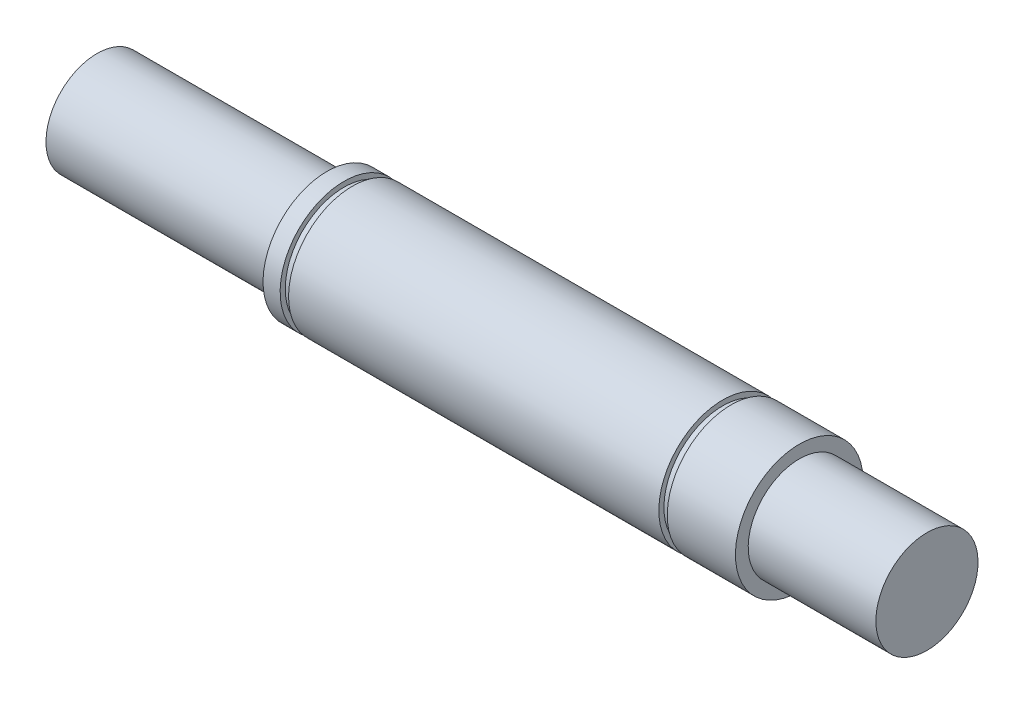
ISO-10303-21;
HEADER;
FILE_DESCRIPTION(('STEP AP214'),'2;1');
FILE_NAME('part.step','',(''),(''),'','','');
FILE_SCHEMA(('AUTOMOTIVE_DESIGN { 1 0 10303 214 1 1 1 1 }'));
ENDSEC;
DATA;
#1=APPLICATION_CONTEXT('core data for automotive mechanical design processes');
#2=APPLICATION_PROTOCOL_DEFINITION('international standard','automotive_design',2000,#1);
#3=PRODUCT_CONTEXT('',#1,'mechanical');
#4=PRODUCT('Part','Part','',(#3));
#5=PRODUCT_RELATED_PRODUCT_CATEGORY('part','',(#4));
#6=PRODUCT_DEFINITION_FORMATION('','',#4);
#7=PRODUCT_DEFINITION_CONTEXT('part definition',#1,'design');
#8=PRODUCT_DEFINITION('design','',#6,#7);
#9=PRODUCT_DEFINITION_SHAPE('','',#8);
#10=(LENGTH_UNIT() NAMED_UNIT(*) SI_UNIT(.MILLI.,.METRE.));
#11=(NAMED_UNIT(*) PLANE_ANGLE_UNIT() SI_UNIT($,.RADIAN.));
#12=(NAMED_UNIT(*) SI_UNIT($,.STERADIAN.) SOLID_ANGLE_UNIT());
#13=UNCERTAINTY_MEASURE_WITH_UNIT(LENGTH_MEASURE(1.E-05),#10,'distance_accuracy_value','');
#14=(GEOMETRIC_REPRESENTATION_CONTEXT(3) GLOBAL_UNCERTAINTY_ASSIGNED_CONTEXT((#13)) GLOBAL_UNIT_ASSIGNED_CONTEXT((#10,
#11,#12)) REPRESENTATION_CONTEXT('',''));
#15=CARTESIAN_POINT('',(0.,0.,0.));
#16=DIRECTION('',(0.,0.,1.));
#17=DIRECTION('',(1.,0.,0.));
#18=AXIS2_PLACEMENT_3D('',#15,#16,#17);
#19=CARTESIAN_POINT('',(-145.473243459258,-1.20454356635751,0.));
#20=DIRECTION('',(-1.,0.,0.));
#21=DIRECTION('',(0.,-1.,0.));
#22=AXIS2_PLACEMENT_3D('',#19,#20,#21);
#23=PLANE('',#22);
#24=CARTESIAN_POINT('',(-145.473243459258,-1.20454356635751,0.));
#25=DIRECTION('',(-1.,0.,0.));
#26=DIRECTION('',(0.,-1.,0.));
#27=AXIS2_PLACEMENT_3D('',#24,#25,#26);
#28=CIRCLE('',#27,4.);
#29=CARTESIAN_POINT('',(-145.473243459258,-5.20454356635751,0.));
#30=VERTEX_POINT('',#29);
#31=EDGE_CURVE('E10',#30,#30,#28,.T.);
#32=ORIENTED_EDGE('',*,*,#31,.F.);
#33=EDGE_LOOP('',(#32));
#34=FACE_BOUND('',#33,.T.);
#35=ADVANCED_FACE('F35',(#34),#23,.F.);
#36=CARTESIAN_POINT('',(-210.473243459258,-1.20454356635751,0.));
#37=DIRECTION('',(-1.,0.,0.));
#38=DIRECTION('',(0.,-1.,0.));
#39=AXIS2_PLACEMENT_3D('',#36,#37,#38);
#40=CYLINDRICAL_SURFACE('',#39,4.);
#41=CARTESIAN_POINT('',(-155.473243459258,-1.20454356635751,0.));
#42=DIRECTION('',(-1.,0.,0.));
#43=DIRECTION('',(0.,-1.,0.));
#44=AXIS2_PLACEMENT_3D('',#41,#42,#43);
#45=CIRCLE('',#44,4.);
#46=CARTESIAN_POINT('',(-155.473243459258,-5.20454356635751,0.));
#47=VERTEX_POINT('',#46);
#48=EDGE_CURVE('E41',#47,#47,#45,.T.);
#49=ORIENTED_EDGE('',*,*,#48,.F.);
#50=EDGE_LOOP('',(#49));
#51=FACE_BOUND('',#50,.T.);
#52=ORIENTED_EDGE('',*,*,#31,.T.);
#53=EDGE_LOOP('',(#52));
#54=FACE_BOUND('',#53,.T.);
#55=ADVANCED_FACE('F155',(#51,#54),#40,.T.);
#56=CARTESIAN_POINT('',(-155.473243459258,2.79545643364249,0.));
#57=DIRECTION('',(-1.,0.,0.));
#58=DIRECTION('',(0.,-1.,0.));
#59=AXIS2_PLACEMENT_3D('',#56,#57,#58);
#60=PLANE('',#59);
#61=CARTESIAN_POINT('',(-155.473243459258,-1.20454356635751,0.));
#62=DIRECTION('',(-1.,0.,0.));
#63=DIRECTION('',(0.,-1.,0.));
#64=AXIS2_PLACEMENT_3D('',#61,#62,#63);
#65=CIRCLE('',#64,5.);
#66=CARTESIAN_POINT('',(-155.473243459258,-6.20454356635751,0.));
#67=VERTEX_POINT('',#66);
#68=EDGE_CURVE('E45',#67,#67,#65,.T.);
#69=ORIENTED_EDGE('',*,*,#68,.F.);
#70=EDGE_LOOP('',(#69));
#71=FACE_BOUND('',#70,.T.);
#72=ORIENTED_EDGE('',*,*,#48,.T.);
#73=EDGE_LOOP('',(#72));
#74=FACE_BOUND('',#73,.T.);
#75=ADVANCED_FACE('F150',(#71,#74),#60,.F.);
#76=CARTESIAN_POINT('',(-210.473243459258,-1.20454356635751,0.));
#77=DIRECTION('',(-1.,0.,0.));
#78=DIRECTION('',(0.,-1.,0.));
#79=AXIS2_PLACEMENT_3D('',#76,#77,#78);
#80=CYLINDRICAL_SURFACE('',#79,5.);
#81=CARTESIAN_POINT('',(-160.813243459258,-1.20454356635751,0.));
#82=DIRECTION('',(-1.,0.,0.));
#83=DIRECTION('',(0.,-1.,0.));
#84=AXIS2_PLACEMENT_3D('',#81,#82,#83);
#85=CIRCLE('',#84,5.);
#86=CARTESIAN_POINT('',(-160.813243459258,-6.20454356635751,0.));
#87=VERTEX_POINT('',#86);
#88=EDGE_CURVE('E49',#87,#87,#85,.T.);
#89=ORIENTED_EDGE('',*,*,#88,.F.);
#90=EDGE_LOOP('',(#89));
#91=FACE_BOUND('',#90,.T.);
#92=ORIENTED_EDGE('',*,*,#68,.T.);
#93=EDGE_LOOP('',(#92));
#94=FACE_BOUND('',#93,.T.);
#95=ADVANCED_FACE('F144',(#91,#94),#80,.T.);
#96=CARTESIAN_POINT('',(-160.813243459258,3.79545643364249,0.));
#97=DIRECTION('',(1.,0.,0.));
#98=DIRECTION('',(0.,1.,0.));
#99=AXIS2_PLACEMENT_3D('',#96,#97,#98);
#100=PLANE('',#99);
#101=CARTESIAN_POINT('',(-160.813243459258,-1.20454356635751,0.));
#102=DIRECTION('',(-1.,0.,0.));
#103=DIRECTION('',(0.,-1.,0.));
#104=AXIS2_PLACEMENT_3D('',#101,#102,#103);
#105=CIRCLE('',#104,4.6);
#106=CARTESIAN_POINT('',(-160.813243459258,-5.80454356635751,0.));
#107=VERTEX_POINT('',#106);
#108=EDGE_CURVE('E54',#107,#107,#105,.T.);
#109=ORIENTED_EDGE('',*,*,#108,.F.);
#110=EDGE_LOOP('',(#109));
#111=FACE_BOUND('',#110,.T.);
#112=ORIENTED_EDGE('',*,*,#88,.T.);
#113=EDGE_LOOP('',(#112));
#114=FACE_BOUND('',#113,.T.);
#115=ADVANCED_FACE('F138',(#111,#114),#100,.F.);
#116=CARTESIAN_POINT('',(-210.473243459258,-1.20454356635751,0.));
#117=DIRECTION('',(-1.,0.,0.));
#118=DIRECTION('',(0.,-1.,0.));
#119=AXIS2_PLACEMENT_3D('',#116,#117,#118);
#120=CYLINDRICAL_SURFACE('',#119,4.6);
#121=CARTESIAN_POINT('',(-161.473243459258,-1.20454356635751,0.));
#122=DIRECTION('',(-1.,0.,0.));
#123=DIRECTION('',(0.,-1.,0.));
#124=AXIS2_PLACEMENT_3D('',#121,#122,#123);
#125=CIRCLE('',#124,4.6);
#126=CARTESIAN_POINT('',(-161.473243459258,-5.80454356635751,0.));
#127=VERTEX_POINT('',#126);
#128=EDGE_CURVE('E57',#127,#127,#125,.T.);
#129=ORIENTED_EDGE('',*,*,#128,.F.);
#130=EDGE_LOOP('',(#129));
#131=FACE_BOUND('',#130,.T.);
#132=ORIENTED_EDGE('',*,*,#108,.T.);
#133=EDGE_LOOP('',(#132));
#134=FACE_BOUND('',#133,.T.);
#135=ADVANCED_FACE('F132',(#131,#134),#120,.T.);
#136=CARTESIAN_POINT('',(-161.473243459258,3.39545643364248,0.));
#137=DIRECTION('',(-1.,0.,0.));
#138=DIRECTION('',(0.,-1.,0.));
#139=AXIS2_PLACEMENT_3D('',#136,#137,#138);
#140=PLANE('',#139);
#141=CARTESIAN_POINT('',(-161.473243459258,-1.20454356635751,0.));
#142=DIRECTION('',(-1.,0.,0.));
#143=DIRECTION('',(0.,-1.,0.));
#144=AXIS2_PLACEMENT_3D('',#141,#142,#143);
#145=CIRCLE('',#144,5.);
#146=CARTESIAN_POINT('',(-161.473243459258,-6.20454356635751,0.));
#147=VERTEX_POINT('',#146);
#148=EDGE_CURVE('E60',#147,#147,#145,.T.);
#149=ORIENTED_EDGE('',*,*,#148,.F.);
#150=EDGE_LOOP('',(#149));
#151=FACE_BOUND('',#150,.T.);
#152=ORIENTED_EDGE('',*,*,#128,.T.);
#153=EDGE_LOOP('',(#152));
#154=FACE_BOUND('',#153,.T.);
#155=ADVANCED_FACE('F126',(#151,#154),#140,.F.);
#156=CARTESIAN_POINT('',(-210.473243459258,-1.20454356635751,0.));
#157=DIRECTION('',(-1.,0.,0.));
#158=DIRECTION('',(0.,-1.,0.));
#159=AXIS2_PLACEMENT_3D('',#156,#157,#158);
#160=CYLINDRICAL_SURFACE('',#159,4.99999999999999);
#161=CARTESIAN_POINT('',(-190.473243459258,-1.20454356635751,0.));
#162=DIRECTION('',(-1.,0.,0.));
#163=DIRECTION('',(0.,-1.,0.));
#164=AXIS2_PLACEMENT_3D('',#161,#162,#163);
#165=CIRCLE('',#164,4.99999999999999);
#166=CARTESIAN_POINT('',(-190.473243459258,-6.2045435663575,0.));
#167=VERTEX_POINT('',#166);
#168=EDGE_CURVE('E63',#167,#167,#165,.T.);
#169=ORIENTED_EDGE('',*,*,#168,.F.);
#170=EDGE_LOOP('',(#169));
#171=FACE_BOUND('',#170,.T.);
#172=ORIENTED_EDGE('',*,*,#148,.T.);
#173=EDGE_LOOP('',(#172));
#174=FACE_BOUND('',#173,.T.);
#175=ADVANCED_FACE('F120',(#171,#174),#160,.T.);
#176=CARTESIAN_POINT('',(-190.473243459258,3.79545643364248,0.));
#177=DIRECTION('',(1.,0.,0.));
#178=DIRECTION('',(0.,1.,0.));
#179=AXIS2_PLACEMENT_3D('',#176,#177,#178);
#180=PLANE('',#179);
#181=CARTESIAN_POINT('',(-190.473243459258,-1.20454356635751,0.));
#182=DIRECTION('',(-1.,0.,0.));
#183=DIRECTION('',(0.,-1.,0.));
#184=AXIS2_PLACEMENT_3D('',#181,#182,#183);
#185=CIRCLE('',#184,4.59999999999999);
#186=CARTESIAN_POINT('',(-190.473243459258,-5.8045435663575,0.));
#187=VERTEX_POINT('',#186);
#188=EDGE_CURVE('E66',#187,#187,#185,.T.);
#189=ORIENTED_EDGE('',*,*,#188,.F.);
#190=EDGE_LOOP('',(#189));
#191=FACE_BOUND('',#190,.T.);
#192=ORIENTED_EDGE('',*,*,#168,.T.);
#193=EDGE_LOOP('',(#192));
#194=FACE_BOUND('',#193,.T.);
#195=ADVANCED_FACE('F114',(#191,#194),#180,.F.);
#196=CARTESIAN_POINT('',(-210.473243459258,-1.20454356635751,0.));
#197=DIRECTION('',(-1.,0.,0.));
#198=DIRECTION('',(0.,-1.,0.));
#199=AXIS2_PLACEMENT_3D('',#196,#197,#198);
#200=CYLINDRICAL_SURFACE('',#199,4.59999999999999);
#201=CARTESIAN_POINT('',(-191.133243459258,-1.20454356635751,0.));
#202=DIRECTION('',(-1.,0.,0.));
#203=DIRECTION('',(0.,-1.,0.));
#204=AXIS2_PLACEMENT_3D('',#201,#202,#203);
#205=CIRCLE('',#204,4.59999999999999);
#206=CARTESIAN_POINT('',(-191.133243459258,-5.8045435663575,0.));
#207=VERTEX_POINT('',#206);
#208=EDGE_CURVE('E69',#207,#207,#205,.T.);
#209=ORIENTED_EDGE('',*,*,#208,.F.);
#210=EDGE_LOOP('',(#209));
#211=FACE_BOUND('',#210,.T.);
#212=ORIENTED_EDGE('',*,*,#188,.T.);
#213=EDGE_LOOP('',(#212));
#214=FACE_BOUND('',#213,.T.);
#215=ADVANCED_FACE('F108',(#211,#214),#200,.T.);
#216=CARTESIAN_POINT('',(-191.133243459258,3.39545643364248,0.));
#217=DIRECTION('',(-1.,0.,0.));
#218=DIRECTION('',(0.,-1.,0.));
#219=AXIS2_PLACEMENT_3D('',#216,#217,#218);
#220=PLANE('',#219);
#221=CARTESIAN_POINT('',(-191.133243459258,-1.20454356635751,0.));
#222=DIRECTION('',(-1.,0.,0.));
#223=DIRECTION('',(0.,-1.,0.));
#224=AXIS2_PLACEMENT_3D('',#221,#222,#223);
#225=CIRCLE('',#224,4.99999999999999);
#226=CARTESIAN_POINT('',(-191.133243459258,-6.2045435663575,0.));
#227=VERTEX_POINT('',#226);
#228=EDGE_CURVE('E72',#227,#227,#225,.T.);
#229=ORIENTED_EDGE('',*,*,#228,.F.);
#230=EDGE_LOOP('',(#229));
#231=FACE_BOUND('',#230,.T.);
#232=ORIENTED_EDGE('',*,*,#208,.T.);
#233=EDGE_LOOP('',(#232));
#234=FACE_BOUND('',#233,.T.);
#235=ADVANCED_FACE('F102',(#231,#234),#220,.F.);
#236=CARTESIAN_POINT('',(-210.473243459258,-1.20454356635751,0.));
#237=DIRECTION('',(-1.,0.,0.));
#238=DIRECTION('',(0.,-1.,0.));
#239=AXIS2_PLACEMENT_3D('',#236,#237,#238);
#240=CYLINDRICAL_SURFACE('',#239,4.99999999999999);
#241=CARTESIAN_POINT('',(-192.473243459258,-1.20454356635751,0.));
#242=DIRECTION('',(-1.,0.,0.));
#243=DIRECTION('',(0.,-1.,0.));
#244=AXIS2_PLACEMENT_3D('',#241,#242,#243);
#245=CIRCLE('',#244,4.99999999999999);
#246=CARTESIAN_POINT('',(-192.473243459258,-6.2045435663575,0.));
#247=VERTEX_POINT('',#246);
#248=EDGE_CURVE('E75',#247,#247,#245,.T.);
#249=ORIENTED_EDGE('',*,*,#248,.F.);
#250=EDGE_LOOP('',(#249));
#251=FACE_BOUND('',#250,.T.);
#252=ORIENTED_EDGE('',*,*,#228,.T.);
#253=EDGE_LOOP('',(#252));
#254=FACE_BOUND('',#253,.T.);
#255=ADVANCED_FACE('F96',(#251,#254),#240,.T.);
#256=CARTESIAN_POINT('',(-192.473243459258,3.79545643364248,0.));
#257=DIRECTION('',(1.,0.,0.));
#258=DIRECTION('',(0.,1.,0.));
#259=AXIS2_PLACEMENT_3D('',#256,#257,#258);
#260=PLANE('',#259);
#261=CARTESIAN_POINT('',(-192.473243459258,-1.20454356635751,0.));
#262=DIRECTION('',(-1.,0.,0.));
#263=DIRECTION('',(0.,-1.,0.));
#264=AXIS2_PLACEMENT_3D('',#261,#262,#263);
#265=CIRCLE('',#264,3.99999999999999);
#266=CARTESIAN_POINT('',(-192.473243459258,-5.20454356635751,0.));
#267=VERTEX_POINT('',#266);
#268=EDGE_CURVE('E78',#267,#267,#265,.T.);
#269=ORIENTED_EDGE('',*,*,#268,.F.);
#270=EDGE_LOOP('',(#269));
#271=FACE_BOUND('',#270,.T.);
#272=ORIENTED_EDGE('',*,*,#248,.T.);
#273=EDGE_LOOP('',(#272));
#274=FACE_BOUND('',#273,.T.);
#275=ADVANCED_FACE('F90',(#271,#274),#260,.F.);
#276=CARTESIAN_POINT('',(-210.473243459258,-1.20454356635751,0.));
#277=DIRECTION('',(-1.,0.,0.));
#278=DIRECTION('',(0.,-1.,0.));
#279=AXIS2_PLACEMENT_3D('',#276,#277,#278);
#280=CYLINDRICAL_SURFACE('',#279,3.99999999999999);
#281=CARTESIAN_POINT('',(-210.473243459258,-1.20454356635751,0.));
#282=DIRECTION('',(-1.,0.,0.));
#283=DIRECTION('',(0.,-1.,0.));
#284=AXIS2_PLACEMENT_3D('',#281,#282,#283);
#285=CIRCLE('',#284,3.99999999999999);
#286=CARTESIAN_POINT('',(-210.473243459258,-5.2045435663575,0.));
#287=VERTEX_POINT('',#286);
#288=EDGE_CURVE('E81',#287,#287,#285,.T.);
#289=ORIENTED_EDGE('',*,*,#288,.F.);
#290=EDGE_LOOP('',(#289));
#291=FACE_BOUND('',#290,.T.);
#292=ORIENTED_EDGE('',*,*,#268,.T.);
#293=EDGE_LOOP('',(#292));
#294=FACE_BOUND('',#293,.T.);
#295=ADVANCED_FACE('F87',(#291,#294),#280,.T.);
#296=CARTESIAN_POINT('',(-210.473243459258,2.79545643364248,0.));
#297=DIRECTION('',(1.,0.,0.));
#298=DIRECTION('',(0.,1.,0.));
#299=AXIS2_PLACEMENT_3D('',#296,#297,#298);
#300=PLANE('',#299);
#301=ORIENTED_EDGE('',*,*,#288,.T.);
#302=EDGE_LOOP('',(#301));
#303=FACE_BOUND('',#302,.T.);
#304=ADVANCED_FACE('F85',(#303),#300,.F.);
#305=CLOSED_SHELL('',(#35,#55,#75,#95,#115,#135,#155,#175,#195,#215,#235,#255,#275,#295,#304));
#306=MANIFOLD_SOLID_BREP('B2',#305);
#307=ADVANCED_BREP_SHAPE_REPRESENTATION('',(#18,#306),#14);
#308=SHAPE_DEFINITION_REPRESENTATION(#9,#307);
ENDSEC;
END-ISO-10303-21;
